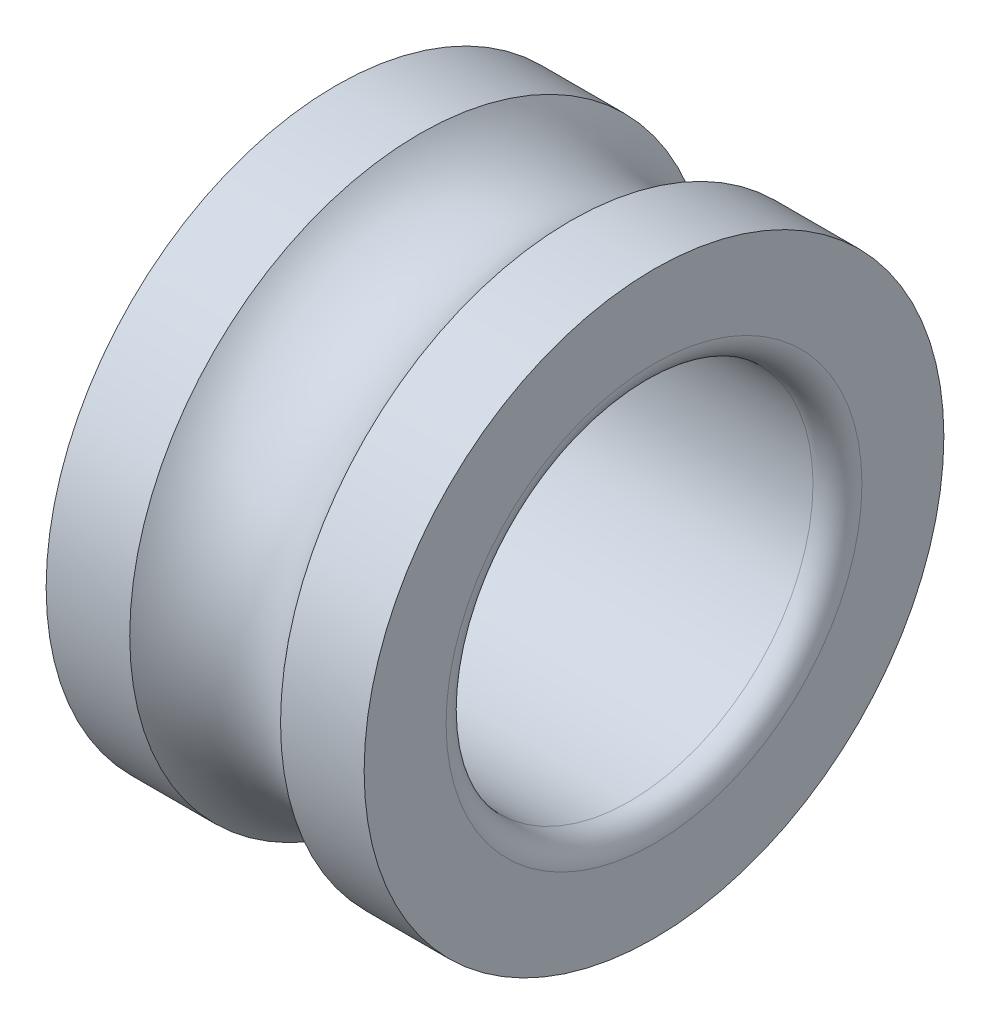
ISO-10303-21;
HEADER;
FILE_DESCRIPTION(('STEP AP214'),'2;1');
FILE_NAME('part.step','',(''),(''),'','','');
FILE_SCHEMA(('AUTOMOTIVE_DESIGN { 1 0 10303 214 1 1 1 1 }'));
ENDSEC;
DATA;
#1=APPLICATION_CONTEXT('core data for automotive mechanical design processes');
#2=APPLICATION_PROTOCOL_DEFINITION('international standard','automotive_design',2000,#1);
#3=PRODUCT_CONTEXT('',#1,'mechanical');
#4=PRODUCT('Part','Part','',(#3));
#5=PRODUCT_RELATED_PRODUCT_CATEGORY('part','',(#4));
#6=PRODUCT_DEFINITION_FORMATION('','',#4);
#7=PRODUCT_DEFINITION_CONTEXT('part definition',#1,'design');
#8=PRODUCT_DEFINITION('design','',#6,#7);
#9=PRODUCT_DEFINITION_SHAPE('','',#8);
#10=(LENGTH_UNIT() NAMED_UNIT(*) SI_UNIT(.MILLI.,.METRE.));
#11=(NAMED_UNIT(*) PLANE_ANGLE_UNIT() SI_UNIT($,.RADIAN.));
#12=(NAMED_UNIT(*) SI_UNIT($,.STERADIAN.) SOLID_ANGLE_UNIT());
#13=UNCERTAINTY_MEASURE_WITH_UNIT(LENGTH_MEASURE(1.E-05),#10,'distance_accuracy_value','');
#14=(GEOMETRIC_REPRESENTATION_CONTEXT(3) GLOBAL_UNCERTAINTY_ASSIGNED_CONTEXT((#13)) GLOBAL_UNIT_ASSIGNED_CONTEXT((#10,
#11,#12)) REPRESENTATION_CONTEXT('',''));
#15=CARTESIAN_POINT('',(0.,0.,0.));
#16=DIRECTION('',(0.,0.,1.));
#17=DIRECTION('',(1.,0.,0.));
#18=AXIS2_PLACEMENT_3D('',#15,#16,#17);
#19=CARTESIAN_POINT('',(1.00000000000008,0.,0.));
#20=DIRECTION('',(-1.,0.,0.));
#21=DIRECTION('',(0.,0.,1.));
#22=AXIS2_PLACEMENT_3D('',#19,#20,#21);
#23=TOROIDAL_SURFACE('',#22,8.50000000000008,1.00000000000008);
#24=CARTESIAN_POINT('',(1.,0.,0.));
#25=DIRECTION('',(-1.,0.,0.));
#26=DIRECTION('',(0.,0.,1.));
#27=AXIS2_PLACEMENT_3D('',#24,#25,#26);
#28=CIRCLE('',#27,7.5);
#29=CARTESIAN_POINT('',(1.,0.,7.5));
#30=VERTEX_POINT('',#29);
#31=EDGE_CURVE('E10',#30,#30,#28,.T.);
#32=ORIENTED_EDGE('',*,*,#31,.F.);
#33=EDGE_LOOP('',(#32));
#34=FACE_BOUND('',#33,.T.);
#35=CARTESIAN_POINT('',(0.,0.,0.));
#36=DIRECTION('',(-1.,0.,0.));
#37=DIRECTION('',(0.,0.,1.));
#38=AXIS2_PLACEMENT_3D('',#35,#36,#37);
#39=CIRCLE('',#38,8.5);
#40=CARTESIAN_POINT('',(0.,0.,8.5));
#41=VERTEX_POINT('',#40);
#42=EDGE_CURVE('E63',#41,#41,#39,.T.);
#43=ORIENTED_EDGE('',*,*,#42,.T.);
#44=EDGE_LOOP('',(#43));
#45=FACE_BOUND('',#44,.T.);
#46=ADVANCED_FACE('F35',(#34,#45),#23,.T.);
#47=CARTESIAN_POINT('',(50.,0.,0.));
#48=DIRECTION('',(-1.,0.,0.));
#49=DIRECTION('',(0.,0.,1.));
#50=AXIS2_PLACEMENT_3D('',#47,#48,#49);
#51=CYLINDRICAL_SURFACE('',#50,7.5);
#52=CARTESIAN_POINT('',(12.,0.,0.));
#53=DIRECTION('',(-1.,0.,0.));
#54=DIRECTION('',(0.,0.,1.));
#55=AXIS2_PLACEMENT_3D('',#52,#53,#54);
#56=CIRCLE('',#55,7.5);
#57=CARTESIAN_POINT('',(12.,0.,7.5));
#58=VERTEX_POINT('',#57);
#59=EDGE_CURVE('E41',#58,#58,#56,.T.);
#60=ORIENTED_EDGE('',*,*,#59,.F.);
#61=EDGE_LOOP('',(#60));
#62=FACE_BOUND('',#61,.T.);
#63=ORIENTED_EDGE('',*,*,#31,.T.);
#64=EDGE_LOOP('',(#63));
#65=FACE_BOUND('',#64,.T.);
#66=ADVANCED_FACE('F100',(#62,#65),#51,.F.);
#67=CARTESIAN_POINT('',(12.0000000000007,0.,0.));
#68=DIRECTION('',(-1.,0.,0.));
#69=DIRECTION('',(0.,0.,1.));
#70=AXIS2_PLACEMENT_3D('',#67,#68,#69);
#71=TOROIDAL_SURFACE('',#70,8.49999999999931,0.999999999999306);
#72=CARTESIAN_POINT('',(13.,0.,0.));
#73=DIRECTION('',(-1.,0.,0.));
#74=DIRECTION('',(0.,0.,1.));
#75=AXIS2_PLACEMENT_3D('',#72,#73,#74);
#76=CIRCLE('',#75,8.50000000000069);
#77=CARTESIAN_POINT('',(13.,0.,8.50000000000069));
#78=VERTEX_POINT('',#77);
#79=EDGE_CURVE('E45',#78,#78,#76,.T.);
#80=ORIENTED_EDGE('',*,*,#79,.F.);
#81=EDGE_LOOP('',(#80));
#82=FACE_BOUND('',#81,.T.);
#83=ORIENTED_EDGE('',*,*,#59,.T.);
#84=EDGE_LOOP('',(#83));
#85=FACE_BOUND('',#84,.T.);
#86=ADVANCED_FACE('F95',(#82,#85),#71,.T.);
#87=CARTESIAN_POINT('',(13.,8.50000000000069,0.));
#88=DIRECTION('',(-1.,0.,0.));
#89=DIRECTION('',(0.,0.,1.));
#90=AXIS2_PLACEMENT_3D('',#87,#88,#89);
#91=PLANE('',#90);
#92=CARTESIAN_POINT('',(13.,0.,0.));
#93=DIRECTION('',(-1.,0.,0.));
#94=DIRECTION('',(0.,0.,1.));
#95=AXIS2_PLACEMENT_3D('',#92,#93,#94);
#96=CIRCLE('',#95,11.85);
#97=CARTESIAN_POINT('',(13.,0.,11.85));
#98=VERTEX_POINT('',#97);
#99=EDGE_CURVE('E49',#98,#98,#96,.T.);
#100=ORIENTED_EDGE('',*,*,#99,.F.);
#101=EDGE_LOOP('',(#100));
#102=FACE_BOUND('',#101,.T.);
#103=ORIENTED_EDGE('',*,*,#79,.T.);
#104=EDGE_LOOP('',(#103));
#105=FACE_BOUND('',#104,.T.);
#106=ADVANCED_FACE('F89',(#102,#105),#91,.F.);
#107=CARTESIAN_POINT('',(50.,0.,0.));
#108=DIRECTION('',(-1.,0.,0.));
#109=DIRECTION('',(0.,0.,1.));
#110=AXIS2_PLACEMENT_3D('',#107,#108,#109);
#111=CYLINDRICAL_SURFACE('',#110,11.85);
#112=CARTESIAN_POINT('',(9.5826873016899,0.,0.));
#113=DIRECTION('',(-1.,0.,0.));
#114=DIRECTION('',(0.,0.,1.));
#115=AXIS2_PLACEMENT_3D('',#112,#113,#114);
#116=CIRCLE('',#115,11.85);
#117=CARTESIAN_POINT('',(9.5826873016899,0.,11.85));
#118=VERTEX_POINT('',#117);
#119=EDGE_CURVE('E54',#118,#118,#116,.T.);
#120=ORIENTED_EDGE('',*,*,#119,.F.);
#121=EDGE_LOOP('',(#120));
#122=FACE_BOUND('',#121,.T.);
#123=ORIENTED_EDGE('',*,*,#99,.T.);
#124=EDGE_LOOP('',(#123));
#125=FACE_BOUND('',#124,.T.);
#126=ADVANCED_FACE('F83',(#122,#125),#111,.T.);
#127=CARTESIAN_POINT('',(6.5,0.,0.));
#128=DIRECTION('',(-1.,0.,0.));
#129=DIRECTION('',(0.,0.,1.));
#130=AXIS2_PLACEMENT_3D('',#127,#128,#129);
#131=TOROIDAL_SURFACE('',#130,14.3500000000001,3.96900000000005);
#132=CARTESIAN_POINT('',(3.4173126983101,0.,0.));
#133=DIRECTION('',(-1.,0.,0.));
#134=DIRECTION('',(0.,0.,1.));
#135=AXIS2_PLACEMENT_3D('',#132,#133,#134);
#136=CIRCLE('',#135,11.85);
#137=CARTESIAN_POINT('',(3.4173126983101,0.,11.85));
#138=VERTEX_POINT('',#137);
#139=EDGE_CURVE('E57',#138,#138,#136,.T.);
#140=ORIENTED_EDGE('',*,*,#139,.F.);
#141=EDGE_LOOP('',(#140));
#142=FACE_BOUND('',#141,.T.);
#143=ORIENTED_EDGE('',*,*,#119,.T.);
#144=EDGE_LOOP('',(#143));
#145=FACE_BOUND('',#144,.T.);
#146=ADVANCED_FACE('F77',(#142,#145),#131,.F.);
#147=CARTESIAN_POINT('',(50.,0.,0.));
#148=DIRECTION('',(-1.,0.,0.));
#149=DIRECTION('',(0.,0.,1.));
#150=AXIS2_PLACEMENT_3D('',#147,#148,#149);
#151=CYLINDRICAL_SURFACE('',#150,11.85);
#152=CARTESIAN_POINT('',(0.,0.,0.));
#153=DIRECTION('',(-1.,0.,0.));
#154=DIRECTION('',(0.,0.,1.));
#155=AXIS2_PLACEMENT_3D('',#152,#153,#154);
#156=CIRCLE('',#155,11.85);
#157=CARTESIAN_POINT('',(0.,0.,11.85));
#158=VERTEX_POINT('',#157);
#159=EDGE_CURVE('E60',#158,#158,#156,.T.);
#160=ORIENTED_EDGE('',*,*,#159,.F.);
#161=EDGE_LOOP('',(#160));
#162=FACE_BOUND('',#161,.T.);
#163=ORIENTED_EDGE('',*,*,#139,.T.);
#164=EDGE_LOOP('',(#163));
#165=FACE_BOUND('',#164,.T.);
#166=ADVANCED_FACE('F71',(#162,#165),#151,.T.);
#167=CARTESIAN_POINT('',(0.,11.85,0.));
#168=DIRECTION('',(1.,0.,0.));
#169=DIRECTION('',(0.,0.,-1.));
#170=AXIS2_PLACEMENT_3D('',#167,#168,#169);
#171=PLANE('',#170);
#172=ORIENTED_EDGE('',*,*,#42,.F.);
#173=EDGE_LOOP('',(#172));
#174=FACE_BOUND('',#173,.T.);
#175=ORIENTED_EDGE('',*,*,#159,.T.);
#176=EDGE_LOOP('',(#175));
#177=FACE_BOUND('',#176,.T.);
#178=ADVANCED_FACE('F68',(#174,#177),#171,.F.);
#179=CLOSED_SHELL('',(#46,#66,#86,#106,#126,#146,#166,#178));
#180=MANIFOLD_SOLID_BREP('B2',#179);
#181=ADVANCED_BREP_SHAPE_REPRESENTATION('',(#18,#180),#14);
#182=SHAPE_DEFINITION_REPRESENTATION(#9,#181);
ENDSEC;
END-ISO-10303-21;
